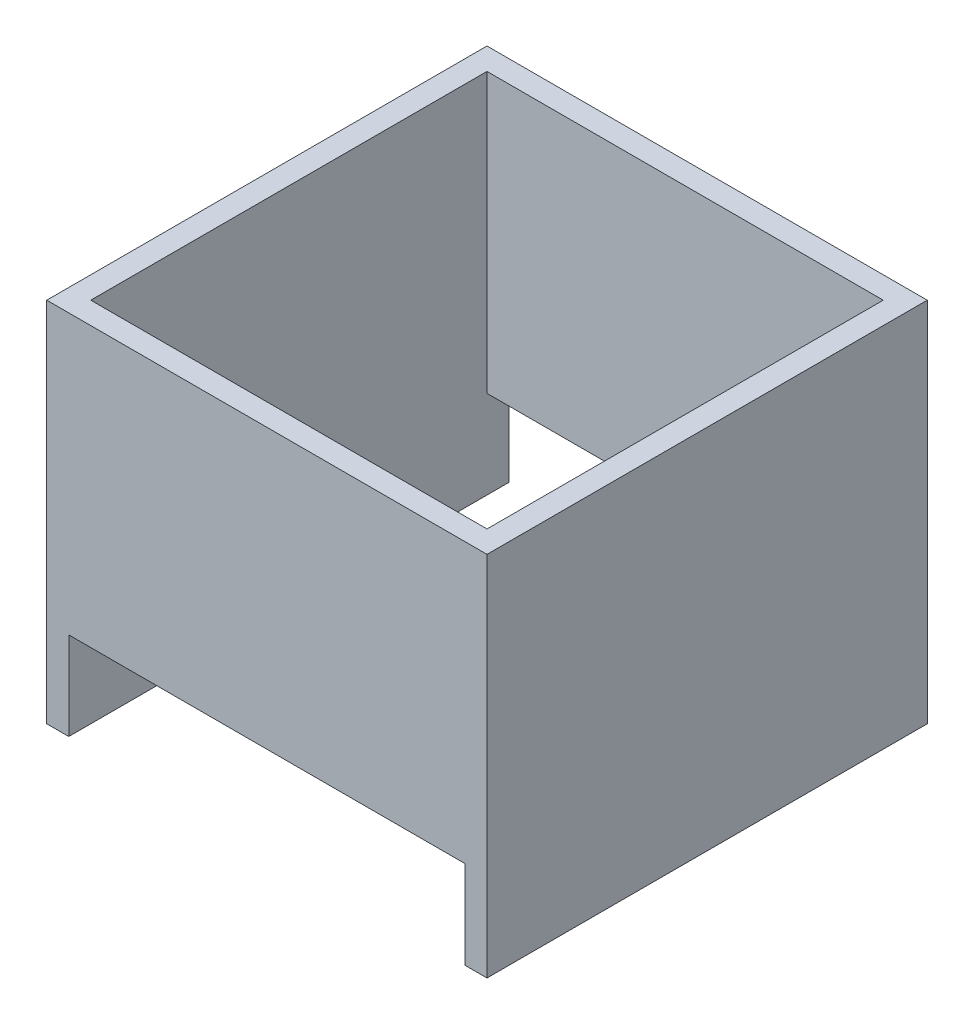
ISO-10303-21;
HEADER;
FILE_DESCRIPTION(('STEP AP214'),'2;1');
FILE_NAME('part.step','',(''),(''),'','','');
FILE_SCHEMA(('AUTOMOTIVE_DESIGN { 1 0 10303 214 1 1 1 1 }'));
ENDSEC;
DATA;
#1=APPLICATION_CONTEXT('core data for automotive mechanical design processes');
#2=APPLICATION_PROTOCOL_DEFINITION('international standard','automotive_design',2000,#1);
#3=PRODUCT_CONTEXT('',#1,'mechanical');
#4=PRODUCT('Part','Part','',(#3));
#5=PRODUCT_RELATED_PRODUCT_CATEGORY('part','',(#4));
#6=PRODUCT_DEFINITION_FORMATION('','',#4);
#7=PRODUCT_DEFINITION_CONTEXT('part definition',#1,'design');
#8=PRODUCT_DEFINITION('design','',#6,#7);
#9=PRODUCT_DEFINITION_SHAPE('','',#8);
#10=(LENGTH_UNIT() NAMED_UNIT(*) SI_UNIT(.MILLI.,.METRE.));
#11=(NAMED_UNIT(*) PLANE_ANGLE_UNIT() SI_UNIT($,.RADIAN.));
#12=(NAMED_UNIT(*) SI_UNIT($,.STERADIAN.) SOLID_ANGLE_UNIT());
#13=UNCERTAINTY_MEASURE_WITH_UNIT(LENGTH_MEASURE(1.E-05),#10,'distance_accuracy_value','');
#14=(GEOMETRIC_REPRESENTATION_CONTEXT(3) GLOBAL_UNCERTAINTY_ASSIGNED_CONTEXT((#13)) GLOBAL_UNIT_ASSIGNED_CONTEXT((#10,
#11,#12)) REPRESENTATION_CONTEXT('',''));
#15=CARTESIAN_POINT('',(0.,0.,0.));
#16=DIRECTION('',(0.,0.,1.));
#17=DIRECTION('',(1.,0.,0.));
#18=AXIS2_PLACEMENT_3D('',#15,#16,#17);
#19=CARTESIAN_POINT('',(0.,0.,0.));
#20=DIRECTION('',(0.,-1.,0.));
#21=DIRECTION('',(0.,0.,-1.));
#22=AXIS2_PLACEMENT_3D('',#19,#20,#21);
#23=PLANE('',#22);
#24=DIRECTION('',(0.,0.,-1.));
#25=VECTOR('',#24,1.);
#26=CARTESIAN_POINT('',(57.,0.,-3.));
#27=LINE('',#26,#25);
#28=CARTESIAN_POINT('',(57.,0.,0.));
#29=VERTEX_POINT('',#28);
#30=CARTESIAN_POINT('',(57.,0.,-60.));
#31=VERTEX_POINT('',#30);
#32=EDGE_CURVE('E177',#29,#31,#27,.T.);
#33=ORIENTED_EDGE('',*,*,#32,.T.);
#34=DIRECTION('',(-1.,0.,0.));
#35=VECTOR('',#34,1.);
#36=CARTESIAN_POINT('',(0.,0.,-60.));
#37=LINE('',#36,#35);
#38=CARTESIAN_POINT('',(60.,0.,-60.));
#39=VERTEX_POINT('',#38);
#40=EDGE_CURVE('E150',#39,#31,#37,.T.);
#41=ORIENTED_EDGE('',*,*,#40,.F.);
#42=DIRECTION('',(0.,0.,-1.));
#43=VECTOR('',#42,1.);
#44=CARTESIAN_POINT('',(60.,0.,0.));
#45=LINE('',#44,#43);
#46=CARTESIAN_POINT('',(60.,0.,0.));
#47=VERTEX_POINT('',#46);
#48=EDGE_CURVE('E227',#47,#39,#45,.T.);
#49=ORIENTED_EDGE('',*,*,#48,.F.);
#50=DIRECTION('',(1.,0.,0.));
#51=VECTOR('',#50,1.);
#52=CARTESIAN_POINT('',(0.,0.,0.));
#53=LINE('',#52,#51);
#54=EDGE_CURVE('E222',#29,#47,#53,.T.);
#55=ORIENTED_EDGE('',*,*,#54,.F.);
#56=EDGE_LOOP('',(#33,#41,#49,#55));
#57=FACE_BOUND('',#56,.T.);
#58=ADVANCED_FACE('F38',(#57),#23,.T.);
#59=CARTESIAN_POINT('',(0.,50.,0.));
#60=DIRECTION('',(0.,-1.,0.));
#61=DIRECTION('',(0.,0.,-1.));
#62=AXIS2_PLACEMENT_3D('',#59,#60,#61);
#63=PLANE('',#62);
#64=DIRECTION('',(0.,0.,1.));
#65=VECTOR('',#64,1.);
#66=CARTESIAN_POINT('',(0.,50.,0.));
#67=LINE('',#66,#65);
#68=CARTESIAN_POINT('',(0.,50.,-60.));
#69=VERTEX_POINT('',#68);
#70=CARTESIAN_POINT('',(0.,50.,0.));
#71=VERTEX_POINT('',#70);
#72=EDGE_CURVE('E205',#69,#71,#67,.T.);
#73=ORIENTED_EDGE('',*,*,#72,.T.);
#74=DIRECTION('',(1.,0.,0.));
#75=VECTOR('',#74,1.);
#76=CARTESIAN_POINT('',(0.,50.,0.));
#77=LINE('',#76,#75);
#78=CARTESIAN_POINT('',(60.,50.,0.));
#79=VERTEX_POINT('',#78);
#80=EDGE_CURVE('E209',#71,#79,#77,.T.);
#81=ORIENTED_EDGE('',*,*,#80,.T.);
#82=DIRECTION('',(0.,0.,-1.));
#83=VECTOR('',#82,1.);
#84=CARTESIAN_POINT('',(60.,50.,0.));
#85=LINE('',#84,#83);
#86=CARTESIAN_POINT('',(60.,50.,-60.));
#87=VERTEX_POINT('',#86);
#88=EDGE_CURVE('E212',#79,#87,#85,.T.);
#89=ORIENTED_EDGE('',*,*,#88,.T.);
#90=DIRECTION('',(-1.,0.,0.));
#91=VECTOR('',#90,1.);
#92=CARTESIAN_POINT('',(0.,50.,-60.));
#93=LINE('',#92,#91);
#94=EDGE_CURVE('E215',#87,#69,#93,.T.);
#95=ORIENTED_EDGE('',*,*,#94,.T.);
#96=EDGE_LOOP('',(#73,#81,#89,#95));
#97=FACE_BOUND('',#96,.T.);
#98=DIRECTION('',(0.,0.,1.));
#99=VECTOR('',#98,1.);
#100=CARTESIAN_POINT('',(2.99999999999999,50.,-3.));
#101=LINE('',#100,#99);
#102=CARTESIAN_POINT('',(3.,50.,-57.));
#103=VERTEX_POINT('',#102);
#104=CARTESIAN_POINT('',(2.99999999999999,50.,-3.));
#105=VERTEX_POINT('',#104);
#106=EDGE_CURVE('E173',#103,#105,#101,.T.);
#107=ORIENTED_EDGE('',*,*,#106,.F.);
#108=DIRECTION('',(-1.,0.,0.));
#109=VECTOR('',#108,1.);
#110=CARTESIAN_POINT('',(3.,50.,-57.));
#111=LINE('',#110,#109);
#112=CARTESIAN_POINT('',(57.,50.,-57.));
#113=VERTEX_POINT('',#112);
#114=EDGE_CURVE('E183',#113,#103,#111,.T.);
#115=ORIENTED_EDGE('',*,*,#114,.F.);
#116=DIRECTION('',(0.,0.,-1.));
#117=VECTOR('',#116,1.);
#118=CARTESIAN_POINT('',(57.,50.,-3.));
#119=LINE('',#118,#117);
#120=CARTESIAN_POINT('',(57.,50.,-3.));
#121=VERTEX_POINT('',#120);
#122=EDGE_CURVE('E180',#121,#113,#119,.T.);
#123=ORIENTED_EDGE('',*,*,#122,.F.);
#124=DIRECTION('',(1.,0.,0.));
#125=VECTOR('',#124,1.);
#126=CARTESIAN_POINT('',(2.99999999999999,50.,-3.));
#127=LINE('',#126,#125);
#128=EDGE_CURVE('E176',#105,#121,#127,.T.);
#129=ORIENTED_EDGE('',*,*,#128,.F.);
#130=EDGE_LOOP('',(#107,#115,#123,#129));
#131=FACE_BOUND('',#130,.T.);
#132=ADVANCED_FACE('F278',(#97,#131),#63,.F.);
#133=DIRECTION('',(0.,0.,1.));
#134=VECTOR('',#133,1.);
#135=CARTESIAN_POINT('',(2.99999999999999,0.,-3.));
#136=LINE('',#135,#134);
#137=CARTESIAN_POINT('',(3.,0.,-60.));
#138=VERTEX_POINT('',#137);
#139=CARTESIAN_POINT('',(3.,0.,0.));
#140=VERTEX_POINT('',#139);
#141=EDGE_CURVE('E172',#138,#140,#136,.T.);
#142=ORIENTED_EDGE('',*,*,#141,.T.);
#143=CARTESIAN_POINT('',(0.,0.,0.));
#144=VERTEX_POINT('',#143);
#145=EDGE_CURVE('E223',#144,#140,#53,.T.);
#146=ORIENTED_EDGE('',*,*,#145,.F.);
#147=DIRECTION('',(0.,0.,1.));
#148=VECTOR('',#147,1.);
#149=CARTESIAN_POINT('',(0.,0.,0.));
#150=LINE('',#149,#148);
#151=CARTESIAN_POINT('',(0.,0.,-60.));
#152=VERTEX_POINT('',#151);
#153=EDGE_CURVE('E204',#152,#144,#150,.T.);
#154=ORIENTED_EDGE('',*,*,#153,.F.);
#155=EDGE_CURVE('E230',#138,#152,#37,.T.);
#156=ORIENTED_EDGE('',*,*,#155,.F.);
#157=EDGE_LOOP('',(#142,#146,#154,#156));
#158=FACE_BOUND('',#157,.T.);
#159=ADVANCED_FACE('F256',(#158),#23,.T.);
#160=CARTESIAN_POINT('',(0.,50.,0.));
#161=DIRECTION('',(1.,0.,0.));
#162=DIRECTION('',(0.,0.,-1.));
#163=AXIS2_PLACEMENT_3D('',#160,#161,#162);
#164=PLANE('',#163);
#165=ORIENTED_EDGE('',*,*,#153,.T.);
#166=DIRECTION('',(0.,-1.,0.));
#167=VECTOR('',#166,1.);
#168=CARTESIAN_POINT('',(0.,50.,0.));
#169=LINE('',#168,#167);
#170=EDGE_CURVE('E47',#71,#144,#169,.T.);
#171=ORIENTED_EDGE('',*,*,#170,.F.);
#172=ORIENTED_EDGE('',*,*,#72,.F.);
#173=DIRECTION('',(0.,-1.,0.));
#174=VECTOR('',#173,1.);
#175=CARTESIAN_POINT('',(0.,50.,-60.));
#176=LINE('',#175,#174);
#177=EDGE_CURVE('E218',#69,#152,#176,.T.);
#178=ORIENTED_EDGE('',*,*,#177,.T.);
#179=EDGE_LOOP('',(#165,#171,#172,#178));
#180=FACE_BOUND('',#179,.T.);
#181=ADVANCED_FACE('F40',(#180),#164,.F.);
#182=CARTESIAN_POINT('',(0.,50.,0.));
#183=DIRECTION('',(0.,0.,-1.));
#184=DIRECTION('',(-1.,0.,0.));
#185=AXIS2_PLACEMENT_3D('',#182,#183,#184);
#186=PLANE('',#185);
#187=DIRECTION('',(-1.,0.,0.));
#188=VECTOR('',#187,1.);
#189=CARTESIAN_POINT('',(57.,12.,0.));
#190=LINE('',#189,#188);
#191=CARTESIAN_POINT('',(57.,12.,0.));
#192=VERTEX_POINT('',#191);
#193=CARTESIAN_POINT('',(3.,12.,0.));
#194=VERTEX_POINT('',#193);
#195=EDGE_CURVE('E156',#192,#194,#190,.T.);
#196=ORIENTED_EDGE('',*,*,#195,.F.);
#197=DIRECTION('',(0.,1.,0.));
#198=VECTOR('',#197,1.);
#199=CARTESIAN_POINT('',(57.,0.,0.));
#200=LINE('',#199,#198);
#201=EDGE_CURVE('E161',#29,#192,#200,.T.);
#202=ORIENTED_EDGE('',*,*,#201,.F.);
#203=ORIENTED_EDGE('',*,*,#54,.T.);
#204=DIRECTION('',(0.,-1.,0.));
#205=VECTOR('',#204,1.);
#206=CARTESIAN_POINT('',(60.,50.,0.));
#207=LINE('',#206,#205);
#208=EDGE_CURVE('E239',#79,#47,#207,.T.);
#209=ORIENTED_EDGE('',*,*,#208,.F.);
#210=ORIENTED_EDGE('',*,*,#80,.F.);
#211=ORIENTED_EDGE('',*,*,#170,.T.);
#212=ORIENTED_EDGE('',*,*,#145,.T.);
#213=DIRECTION('',(0.,-1.,0.));
#214=VECTOR('',#213,1.);
#215=CARTESIAN_POINT('',(3.,0.,0.));
#216=LINE('',#215,#214);
#217=EDGE_CURVE('E152',#194,#140,#216,.T.);
#218=ORIENTED_EDGE('',*,*,#217,.F.);
#219=EDGE_LOOP('',(#196,#202,#203,#209,#210,#211,#212,#218));
#220=FACE_BOUND('',#219,.T.);
#221=ADVANCED_FACE('F247',(#220),#186,.F.);
#222=CARTESIAN_POINT('',(60.,50.,0.));
#223=DIRECTION('',(-1.,0.,0.));
#224=DIRECTION('',(0.,0.,1.));
#225=AXIS2_PLACEMENT_3D('',#222,#223,#224);
#226=PLANE('',#225);
#227=ORIENTED_EDGE('',*,*,#48,.T.);
#228=DIRECTION('',(0.,-1.,0.));
#229=VECTOR('',#228,1.);
#230=CARTESIAN_POINT('',(60.,50.,-60.));
#231=LINE('',#230,#229);
#232=EDGE_CURVE('E236',#87,#39,#231,.T.);
#233=ORIENTED_EDGE('',*,*,#232,.F.);
#234=ORIENTED_EDGE('',*,*,#88,.F.);
#235=ORIENTED_EDGE('',*,*,#208,.T.);
#236=EDGE_LOOP('',(#227,#233,#234,#235));
#237=FACE_BOUND('',#236,.T.);
#238=ADVANCED_FACE('F310',(#237),#226,.F.);
#239=CARTESIAN_POINT('',(0.,50.,-60.));
#240=DIRECTION('',(0.,0.,1.));
#241=DIRECTION('',(1.,0.,0.));
#242=AXIS2_PLACEMENT_3D('',#239,#240,#241);
#243=PLANE('',#242);
#244=ORIENTED_EDGE('',*,*,#40,.T.);
#245=DIRECTION('',(0.,1.,0.));
#246=VECTOR('',#245,1.);
#247=CARTESIAN_POINT('',(57.,0.,-60.));
#248=LINE('',#247,#246);
#249=CARTESIAN_POINT('',(57.,12.,-60.));
#250=VERTEX_POINT('',#249);
#251=EDGE_CURVE('E129',#31,#250,#248,.T.);
#252=ORIENTED_EDGE('',*,*,#251,.T.);
#253=DIRECTION('',(-1.,0.,0.));
#254=VECTOR('',#253,1.);
#255=CARTESIAN_POINT('',(57.,12.,-60.));
#256=LINE('',#255,#254);
#257=CARTESIAN_POINT('',(3.,12.,-60.));
#258=VERTEX_POINT('',#257);
#259=EDGE_CURVE('E137',#250,#258,#256,.T.);
#260=ORIENTED_EDGE('',*,*,#259,.T.);
#261=DIRECTION('',(0.,-1.,0.));
#262=VECTOR('',#261,1.);
#263=CARTESIAN_POINT('',(3.,0.,-60.));
#264=LINE('',#263,#262);
#265=EDGE_CURVE('E145',#258,#138,#264,.T.);
#266=ORIENTED_EDGE('',*,*,#265,.T.);
#267=ORIENTED_EDGE('',*,*,#155,.T.);
#268=ORIENTED_EDGE('',*,*,#177,.F.);
#269=ORIENTED_EDGE('',*,*,#94,.F.);
#270=ORIENTED_EDGE('',*,*,#232,.T.);
#271=EDGE_LOOP('',(#244,#252,#260,#266,#267,#268,#269,#270));
#272=FACE_BOUND('',#271,.T.);
#273=ADVANCED_FACE('F147',(#272),#243,.F.);
#274=CARTESIAN_POINT('',(2.99999999999999,50.,-3.));
#275=DIRECTION('',(1.,0.,0.));
#276=DIRECTION('',(0.,0.,-1.));
#277=AXIS2_PLACEMENT_3D('',#274,#275,#276);
#278=PLANE('',#277);
#279=DIRECTION('',(0.,-1.,0.));
#280=VECTOR('',#279,1.);
#281=CARTESIAN_POINT('',(2.99999999999999,50.,-3.));
#282=LINE('',#281,#280);
#283=CARTESIAN_POINT('',(2.99999999999999,12.,-3.));
#284=VERTEX_POINT('',#283);
#285=EDGE_CURVE('E200',#105,#284,#282,.T.);
#286=ORIENTED_EDGE('',*,*,#285,.T.);
#287=DIRECTION('',(0.,0.,1.));
#288=VECTOR('',#287,1.);
#289=CARTESIAN_POINT('',(3.,12.,-60.));
#290=LINE('',#289,#288);
#291=EDGE_CURVE('E54',#284,#194,#290,.T.);
#292=ORIENTED_EDGE('',*,*,#291,.T.);
#293=ORIENTED_EDGE('',*,*,#217,.T.);
#294=ORIENTED_EDGE('',*,*,#141,.F.);
#295=ORIENTED_EDGE('',*,*,#265,.F.);
#296=CARTESIAN_POINT('',(3.,12.,-57.));
#297=VERTEX_POINT('',#296);
#298=EDGE_CURVE('E140',#258,#297,#290,.T.);
#299=ORIENTED_EDGE('',*,*,#298,.T.);
#300=DIRECTION('',(0.,-1.,0.));
#301=VECTOR('',#300,1.);
#302=CARTESIAN_POINT('',(3.,50.,-57.));
#303=LINE('',#302,#301);
#304=EDGE_CURVE('E186',#103,#297,#303,.T.);
#305=ORIENTED_EDGE('',*,*,#304,.F.);
#306=ORIENTED_EDGE('',*,*,#106,.T.);
#307=EDGE_LOOP('',(#286,#292,#293,#294,#295,#299,#305,#306));
#308=FACE_BOUND('',#307,.T.);
#309=ADVANCED_FACE('F258',(#308),#278,.T.);
#310=CARTESIAN_POINT('',(2.99999999999999,50.,-3.));
#311=DIRECTION('',(0.,0.,-1.));
#312=DIRECTION('',(-1.,0.,0.));
#313=AXIS2_PLACEMENT_3D('',#310,#311,#312);
#314=PLANE('',#313);
#315=DIRECTION('',(1.,0.,0.));
#316=VECTOR('',#315,1.);
#317=CARTESIAN_POINT('',(3.,12.,-3.));
#318=LINE('',#317,#316);
#319=CARTESIAN_POINT('',(57.,12.,-3.));
#320=VERTEX_POINT('',#319);
#321=EDGE_CURVE('E168',#284,#320,#318,.T.);
#322=ORIENTED_EDGE('',*,*,#321,.F.);
#323=ORIENTED_EDGE('',*,*,#285,.F.);
#324=ORIENTED_EDGE('',*,*,#128,.T.);
#325=DIRECTION('',(0.,-1.,0.));
#326=VECTOR('',#325,1.);
#327=CARTESIAN_POINT('',(57.,50.,-3.));
#328=LINE('',#327,#326);
#329=EDGE_CURVE('E196',#121,#320,#328,.T.);
#330=ORIENTED_EDGE('',*,*,#329,.T.);
#331=EDGE_LOOP('',(#322,#323,#324,#330));
#332=FACE_BOUND('',#331,.T.);
#333=ADVANCED_FACE('F282',(#332),#314,.T.);
#334=CARTESIAN_POINT('',(57.,50.,-3.));
#335=DIRECTION('',(-1.,0.,0.));
#336=DIRECTION('',(0.,0.,1.));
#337=AXIS2_PLACEMENT_3D('',#334,#335,#336);
#338=PLANE('',#337);
#339=DIRECTION('',(0.,-1.,0.));
#340=VECTOR('',#339,1.);
#341=CARTESIAN_POINT('',(57.,50.,-57.));
#342=LINE('',#341,#340);
#343=CARTESIAN_POINT('',(57.,12.,-57.));
#344=VERTEX_POINT('',#343);
#345=EDGE_CURVE('E132',#113,#344,#342,.T.);
#346=ORIENTED_EDGE('',*,*,#345,.T.);
#347=DIRECTION('',(0.,0.,1.));
#348=VECTOR('',#347,1.);
#349=CARTESIAN_POINT('',(57.,12.,-60.));
#350=LINE('',#349,#348);
#351=EDGE_CURVE('E61',#250,#344,#350,.T.);
#352=ORIENTED_EDGE('',*,*,#351,.F.);
#353=ORIENTED_EDGE('',*,*,#251,.F.);
#354=ORIENTED_EDGE('',*,*,#32,.F.);
#355=ORIENTED_EDGE('',*,*,#201,.T.);
#356=EDGE_CURVE('E134',#320,#192,#350,.T.);
#357=ORIENTED_EDGE('',*,*,#356,.F.);
#358=ORIENTED_EDGE('',*,*,#329,.F.);
#359=ORIENTED_EDGE('',*,*,#122,.T.);
#360=EDGE_LOOP('',(#346,#352,#353,#354,#355,#357,#358,#359));
#361=FACE_BOUND('',#360,.T.);
#362=ADVANCED_FACE('F127',(#361),#338,.T.);
#363=CARTESIAN_POINT('',(3.,50.,-57.));
#364=DIRECTION('',(0.,0.,1.));
#365=DIRECTION('',(1.,0.,0.));
#366=AXIS2_PLACEMENT_3D('',#363,#364,#365);
#367=PLANE('',#366);
#368=DIRECTION('',(-1.,0.,0.));
#369=VECTOR('',#368,1.);
#370=CARTESIAN_POINT('',(3.,12.,-57.));
#371=LINE('',#370,#369);
#372=EDGE_CURVE('E11',#344,#297,#371,.T.);
#373=ORIENTED_EDGE('',*,*,#372,.F.);
#374=ORIENTED_EDGE('',*,*,#345,.F.);
#375=ORIENTED_EDGE('',*,*,#114,.T.);
#376=ORIENTED_EDGE('',*,*,#304,.T.);
#377=EDGE_LOOP('',(#373,#374,#375,#376));
#378=FACE_BOUND('',#377,.T.);
#379=ADVANCED_FACE('F274',(#378),#367,.T.);
#380=CARTESIAN_POINT('',(57.,12.,-60.));
#381=DIRECTION('',(0.,1.,0.));
#382=DIRECTION('',(-1.,0.,0.));
#383=AXIS2_PLACEMENT_3D('',#380,#381,#382);
#384=PLANE('',#383);
#385=ORIENTED_EDGE('',*,*,#372,.T.);
#386=ORIENTED_EDGE('',*,*,#298,.F.);
#387=ORIENTED_EDGE('',*,*,#259,.F.);
#388=ORIENTED_EDGE('',*,*,#351,.T.);
#389=EDGE_LOOP('',(#385,#386,#387,#388));
#390=FACE_BOUND('',#389,.T.);
#391=ADVANCED_FACE('F138',(#390),#384,.F.);
#392=ORIENTED_EDGE('',*,*,#321,.T.);
#393=ORIENTED_EDGE('',*,*,#356,.T.);
#394=ORIENTED_EDGE('',*,*,#195,.T.);
#395=ORIENTED_EDGE('',*,*,#291,.F.);
#396=EDGE_LOOP('',(#392,#393,#394,#395));
#397=FACE_BOUND('',#396,.T.);
#398=ADVANCED_FACE('F261',(#397),#384,.F.);
#399=CLOSED_SHELL('',(#58,#132,#159,#181,#221,#238,#273,#309,#333,#362,#379,#391,#398));
#400=MANIFOLD_SOLID_BREP('B2',#399);
#401=ADVANCED_BREP_SHAPE_REPRESENTATION('',(#18,#400),#14);
#402=SHAPE_DEFINITION_REPRESENTATION(#9,#401);
ENDSEC;
END-ISO-10303-21;
